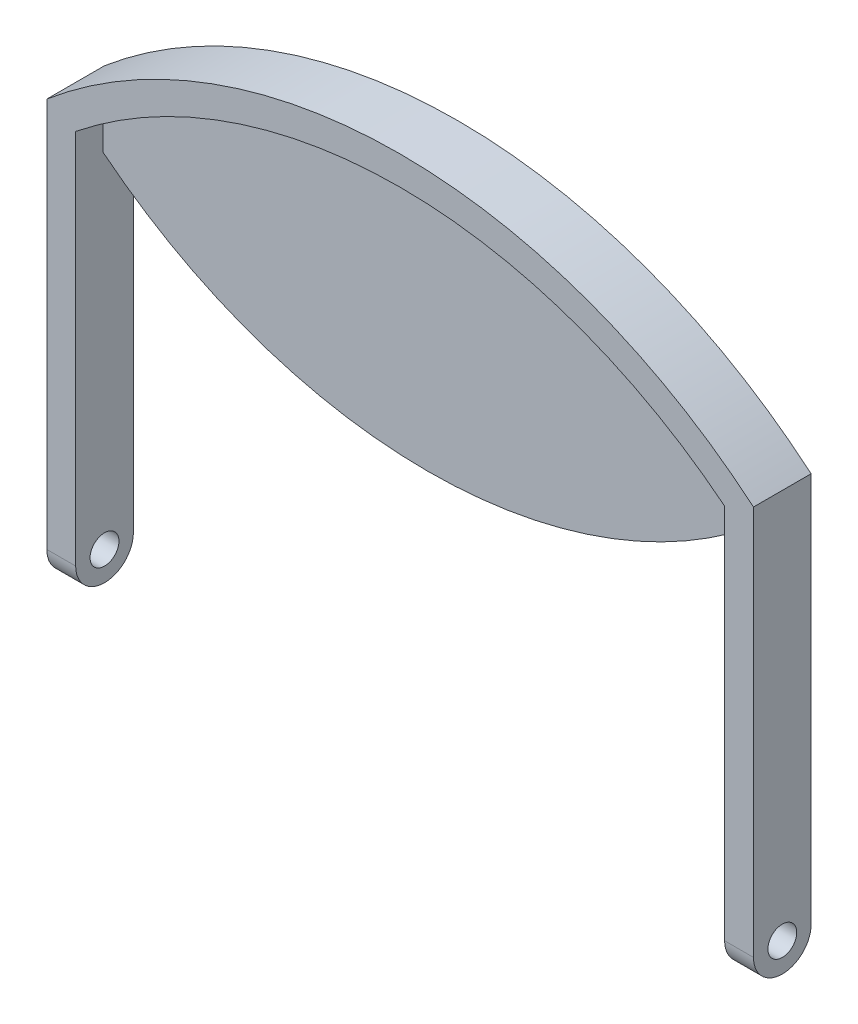
ISO-10303-21;
HEADER;
FILE_DESCRIPTION(('STEP AP214'),'2;1');
FILE_NAME('part.step','',(''),(''),'','','');
FILE_SCHEMA(('AUTOMOTIVE_DESIGN { 1 0 10303 214 1 1 1 1 }'));
ENDSEC;
DATA;
#1=APPLICATION_CONTEXT('core data for automotive mechanical design processes');
#2=APPLICATION_PROTOCOL_DEFINITION('international standard','automotive_design',2000,#1);
#3=PRODUCT_CONTEXT('',#1,'mechanical');
#4=PRODUCT('Part','Part','',(#3));
#5=PRODUCT_RELATED_PRODUCT_CATEGORY('part','',(#4));
#6=PRODUCT_DEFINITION_FORMATION('','',#4);
#7=PRODUCT_DEFINITION_CONTEXT('part definition',#1,'design');
#8=PRODUCT_DEFINITION('design','',#6,#7);
#9=PRODUCT_DEFINITION_SHAPE('','',#8);
#10=(LENGTH_UNIT() NAMED_UNIT(*) SI_UNIT(.MILLI.,.METRE.));
#11=(NAMED_UNIT(*) PLANE_ANGLE_UNIT() SI_UNIT($,.RADIAN.));
#12=(NAMED_UNIT(*) SI_UNIT($,.STERADIAN.) SOLID_ANGLE_UNIT());
#13=UNCERTAINTY_MEASURE_WITH_UNIT(LENGTH_MEASURE(1.E-05),#10,'distance_accuracy_value','');
#14=(GEOMETRIC_REPRESENTATION_CONTEXT(3) GLOBAL_UNCERTAINTY_ASSIGNED_CONTEXT((#13)) GLOBAL_UNIT_ASSIGNED_CONTEXT((#10,
#11,#12)) REPRESENTATION_CONTEXT('',''));
#15=CARTESIAN_POINT('',(0.,0.,0.));
#16=DIRECTION('',(0.,0.,1.));
#17=DIRECTION('',(1.,0.,0.));
#18=AXIS2_PLACEMENT_3D('',#15,#16,#17);
#19=CARTESIAN_POINT('',(-225.,258.975090072072,40.));
#20=DIRECTION('',(-1.,0.,0.));
#21=DIRECTION('',(0.,-1.,0.));
#22=AXIS2_PLACEMENT_3D('',#19,#20,#21);
#23=PLANE('',#22);
#24=CARTESIAN_POINT('',(-225.,20.,20.));
#25=DIRECTION('',(-1.,0.,0.));
#26=DIRECTION('',(0.,-1.,0.));
#27=AXIS2_PLACEMENT_3D('',#24,#25,#26);
#28=CIRCLE('',#27,10.0070147946264);
#29=CARTESIAN_POINT('',(-225.,9.99298520537362,20.));
#30=VERTEX_POINT('',#29);
#31=EDGE_CURVE('E158',#30,#30,#28,.T.);
#32=ORIENTED_EDGE('',*,*,#31,.T.);
#33=EDGE_LOOP('',(#32));
#34=FACE_BOUND('',#33,.T.);
#35=CARTESIAN_POINT('',(-225.,20.,20.));
#36=DIRECTION('',(-1.,0.,0.));
#37=DIRECTION('',(0.,-1.,0.));
#38=AXIS2_PLACEMENT_3D('',#35,#36,#37);
#39=CIRCLE('',#38,20.);
#40=CARTESIAN_POINT('',(-225.,20.,0.));
#41=VERTEX_POINT('',#40);
#42=CARTESIAN_POINT('',(-225.,20.,40.));
#43=VERTEX_POINT('',#42);
#44=EDGE_CURVE('E69',#41,#43,#39,.T.);
#45=ORIENTED_EDGE('',*,*,#44,.F.);
#46=DIRECTION('',(0.,1.,0.));
#47=VECTOR('',#46,1.);
#48=CARTESIAN_POINT('',(-225.,258.975090072072,0.));
#49=LINE('',#48,#47);
#50=CARTESIAN_POINT('',(-225.,281.024909927928,0.));
#51=VERTEX_POINT('',#50);
#52=EDGE_CURVE('E157',#41,#51,#49,.T.);
#53=ORIENTED_EDGE('',*,*,#52,.T.);
#54=DIRECTION('',(0.,0.,-1.));
#55=VECTOR('',#54,1.);
#56=CARTESIAN_POINT('',(-225.,281.024909927928,19.));
#57=LINE('',#56,#55);
#58=CARTESIAN_POINT('',(-225.,281.024909927928,19.));
#59=VERTEX_POINT('',#58);
#60=EDGE_CURVE('E201',#59,#51,#57,.T.);
#61=ORIENTED_EDGE('',*,*,#60,.F.);
#62=DIRECTION('',(0.,1.,0.));
#63=VECTOR('',#62,1.);
#64=CARTESIAN_POINT('',(-225.,258.975090072072,19.));
#65=LINE('',#64,#63);
#66=CARTESIAN_POINT('',(-225.,258.975090072072,19.));
#67=VERTEX_POINT('',#66);
#68=EDGE_CURVE('E240',#67,#59,#65,.T.);
#69=ORIENTED_EDGE('',*,*,#68,.F.);
#70=DIRECTION('',(0.,0.,-1.));
#71=VECTOR('',#70,1.);
#72=CARTESIAN_POINT('',(-225.,258.975090072072,40.));
#73=LINE('',#72,#71);
#74=CARTESIAN_POINT('',(-225.,258.975090072072,21.));
#75=VERTEX_POINT('',#74);
#76=EDGE_CURVE('E180',#75,#67,#73,.T.);
#77=ORIENTED_EDGE('',*,*,#76,.F.);
#78=DIRECTION('',(0.,-1.,0.));
#79=VECTOR('',#78,1.);
#80=CARTESIAN_POINT('',(-225.,258.975090072072,21.));
#81=LINE('',#80,#79);
#82=CARTESIAN_POINT('',(-225.,281.024909927928,21.));
#83=VERTEX_POINT('',#82);
#84=EDGE_CURVE('E216',#83,#75,#81,.T.);
#85=ORIENTED_EDGE('',*,*,#84,.F.);
#86=DIRECTION('',(0.,0.,1.));
#87=VECTOR('',#86,1.);
#88=CARTESIAN_POINT('',(-225.,281.024909927928,21.));
#89=LINE('',#88,#87);
#90=CARTESIAN_POINT('',(-225.,281.024909927928,40.));
#91=VERTEX_POINT('',#90);
#92=EDGE_CURVE('E214',#83,#91,#89,.T.);
#93=ORIENTED_EDGE('',*,*,#92,.T.);
#94=DIRECTION('',(0.,1.,0.));
#95=VECTOR('',#94,1.);
#96=CARTESIAN_POINT('',(-225.,258.975090072072,40.));
#97=LINE('',#96,#95);
#98=EDGE_CURVE('E164',#43,#91,#97,.T.);
#99=ORIENTED_EDGE('',*,*,#98,.F.);
#100=EDGE_LOOP('',(#45,#53,#61,#69,#77,#85,#93,#99));
#101=FACE_BOUND('',#100,.T.);
#102=ADVANCED_FACE('F54',(#34,#101),#23,.F.);
#103=CARTESIAN_POINT('',(225.,258.975090072072,40.));
#104=DIRECTION('',(1.,0.,0.));
#105=DIRECTION('',(0.,1.,0.));
#106=AXIS2_PLACEMENT_3D('',#103,#104,#105);
#107=PLANE('',#106);
#108=CARTESIAN_POINT('',(225.,20.,20.));
#109=DIRECTION('',(1.,0.,0.));
#110=DIRECTION('',(0.,1.,0.));
#111=AXIS2_PLACEMENT_3D('',#108,#109,#110);
#112=CIRCLE('',#111,10.0070147946264);
#113=CARTESIAN_POINT('',(225.,30.0070147946264,20.));
#114=VERTEX_POINT('',#113);
#115=EDGE_CURVE('E294',#114,#114,#112,.T.);
#116=ORIENTED_EDGE('',*,*,#115,.T.);
#117=EDGE_LOOP('',(#116));
#118=FACE_BOUND('',#117,.T.);
#119=DIRECTION('',(0.,-1.,0.));
#120=VECTOR('',#119,1.);
#121=CARTESIAN_POINT('',(225.,258.975090072072,0.));
#122=LINE('',#121,#120);
#123=CARTESIAN_POINT('',(225.,281.024909927928,0.));
#124=VERTEX_POINT('',#123);
#125=CARTESIAN_POINT('',(225.,20.,0.));
#126=VERTEX_POINT('',#125);
#127=EDGE_CURVE('E200',#124,#126,#122,.T.);
#128=ORIENTED_EDGE('',*,*,#127,.T.);
#129=CARTESIAN_POINT('',(225.,20.,20.));
#130=DIRECTION('',(1.,0.,0.));
#131=DIRECTION('',(0.,1.,0.));
#132=AXIS2_PLACEMENT_3D('',#129,#130,#131);
#133=CIRCLE('',#132,20.);
#134=CARTESIAN_POINT('',(225.,20.,40.));
#135=VERTEX_POINT('',#134);
#136=EDGE_CURVE('E209',#135,#126,#133,.T.);
#137=ORIENTED_EDGE('',*,*,#136,.F.);
#138=DIRECTION('',(0.,-1.,0.));
#139=VECTOR('',#138,1.);
#140=CARTESIAN_POINT('',(225.,258.975090072072,40.));
#141=LINE('',#140,#139);
#142=CARTESIAN_POINT('',(225.,281.024909927928,40.));
#143=VERTEX_POINT('',#142);
#144=EDGE_CURVE('E167',#143,#135,#141,.T.);
#145=ORIENTED_EDGE('',*,*,#144,.F.);
#146=DIRECTION('',(0.,0.,1.));
#147=VECTOR('',#146,1.);
#148=CARTESIAN_POINT('',(225.,281.024909927928,21.));
#149=LINE('',#148,#147);
#150=CARTESIAN_POINT('',(225.,281.024909927928,21.));
#151=VERTEX_POINT('',#150);
#152=EDGE_CURVE('E220',#151,#143,#149,.T.);
#153=ORIENTED_EDGE('',*,*,#152,.F.);
#154=DIRECTION('',(0.,1.,0.));
#155=VECTOR('',#154,1.);
#156=CARTESIAN_POINT('',(225.,258.975090072072,21.));
#157=LINE('',#156,#155);
#158=CARTESIAN_POINT('',(225.,258.975090072072,21.));
#159=VERTEX_POINT('',#158);
#160=EDGE_CURVE('E221',#159,#151,#157,.T.);
#161=ORIENTED_EDGE('',*,*,#160,.F.);
#162=DIRECTION('',(0.,0.,-1.));
#163=VECTOR('',#162,1.);
#164=CARTESIAN_POINT('',(225.,258.975090072072,40.));
#165=LINE('',#164,#163);
#166=CARTESIAN_POINT('',(225.,258.975090072072,19.));
#167=VERTEX_POINT('',#166);
#168=EDGE_CURVE('E178',#159,#167,#165,.T.);
#169=ORIENTED_EDGE('',*,*,#168,.T.);
#170=DIRECTION('',(0.,-1.,0.));
#171=VECTOR('',#170,1.);
#172=CARTESIAN_POINT('',(225.,258.975090072072,19.));
#173=LINE('',#172,#171);
#174=CARTESIAN_POINT('',(225.,281.024909927928,19.));
#175=VERTEX_POINT('',#174);
#176=EDGE_CURVE('E234',#175,#167,#173,.T.);
#177=ORIENTED_EDGE('',*,*,#176,.F.);
#178=DIRECTION('',(0.,0.,-1.));
#179=VECTOR('',#178,1.);
#180=CARTESIAN_POINT('',(225.,281.024909927928,19.));
#181=LINE('',#180,#179);
#182=EDGE_CURVE('E243',#175,#124,#181,.T.);
#183=ORIENTED_EDGE('',*,*,#182,.T.);
#184=EDGE_LOOP('',(#128,#137,#145,#153,#161,#169,#177,#183));
#185=FACE_BOUND('',#184,.T.);
#186=ADVANCED_FACE('F251',(#118,#185),#107,.F.);
#187=CARTESIAN_POINT('',(245.,0.,40.));
#188=DIRECTION('',(-1.,0.,0.));
#189=DIRECTION('',(0.,0.,1.));
#190=AXIS2_PLACEMENT_3D('',#187,#188,#189);
#191=PLANE('',#190);
#192=CARTESIAN_POINT('',(245.,20.,20.));
#193=DIRECTION('',(-1.,0.,0.));
#194=DIRECTION('',(0.,0.,1.));
#195=AXIS2_PLACEMENT_3D('',#192,#193,#194);
#196=CIRCLE('',#195,10.0070147946264);
#197=CARTESIAN_POINT('',(245.,20.,30.0070147946264));
#198=VERTEX_POINT('',#197);
#199=EDGE_CURVE('E299',#198,#198,#196,.T.);
#200=ORIENTED_EDGE('',*,*,#199,.T.);
#201=EDGE_LOOP('',(#200));
#202=FACE_BOUND('',#201,.T.);
#203=CARTESIAN_POINT('',(245.,20.,20.));
#204=DIRECTION('',(1.,0.,0.));
#205=DIRECTION('',(0.,0.,-1.));
#206=AXIS2_PLACEMENT_3D('',#203,#204,#205);
#207=CIRCLE('',#206,20.);
#208=CARTESIAN_POINT('',(245.,20.,40.));
#209=VERTEX_POINT('',#208);
#210=CARTESIAN_POINT('',(245.,20.,0.));
#211=VERTEX_POINT('',#210);
#212=EDGE_CURVE('E76',#209,#211,#207,.T.);
#213=ORIENTED_EDGE('',*,*,#212,.T.);
#214=DIRECTION('',(0.,1.,0.));
#215=VECTOR('',#214,1.);
#216=CARTESIAN_POINT('',(245.,0.,0.));
#217=LINE('',#216,#215);
#218=CARTESIAN_POINT('',(245.,290.473750965556,0.));
#219=VERTEX_POINT('',#218);
#220=EDGE_CURVE('E169',#211,#219,#217,.T.);
#221=ORIENTED_EDGE('',*,*,#220,.T.);
#222=DIRECTION('',(0.,0.,-1.));
#223=VECTOR('',#222,1.);
#224=CARTESIAN_POINT('',(245.,290.473750965556,40.));
#225=LINE('',#224,#223);
#226=CARTESIAN_POINT('',(245.,290.473750965556,40.));
#227=VERTEX_POINT('',#226);
#228=EDGE_CURVE('E174',#227,#219,#225,.T.);
#229=ORIENTED_EDGE('',*,*,#228,.F.);
#230=DIRECTION('',(0.,1.,0.));
#231=VECTOR('',#230,1.);
#232=CARTESIAN_POINT('',(245.,0.,40.));
#233=LINE('',#232,#231);
#234=EDGE_CURVE('E186',#209,#227,#233,.T.);
#235=ORIENTED_EDGE('',*,*,#234,.F.);
#236=EDGE_LOOP('',(#213,#221,#229,#235));
#237=FACE_BOUND('',#236,.T.);
#238=ADVANCED_FACE('F191',(#202,#237),#191,.F.);
#239=CARTESIAN_POINT('',(-245.,0.,40.));
#240=DIRECTION('',(1.,0.,0.));
#241=DIRECTION('',(0.,0.,-1.));
#242=AXIS2_PLACEMENT_3D('',#239,#240,#241);
#243=PLANE('',#242);
#244=CARTESIAN_POINT('',(-245.,20.,20.));
#245=DIRECTION('',(1.,0.,0.));
#246=DIRECTION('',(0.,0.,-1.));
#247=AXIS2_PLACEMENT_3D('',#244,#245,#246);
#248=CIRCLE('',#247,10.0070147946264);
#249=CARTESIAN_POINT('',(-245.,20.,9.99298520537362));
#250=VERTEX_POINT('',#249);
#251=EDGE_CURVE('E57',#250,#250,#248,.T.);
#252=ORIENTED_EDGE('',*,*,#251,.T.);
#253=EDGE_LOOP('',(#252));
#254=FACE_BOUND('',#253,.T.);
#255=DIRECTION('',(0.,-1.,0.));
#256=VECTOR('',#255,1.);
#257=CARTESIAN_POINT('',(-245.,0.,0.));
#258=LINE('',#257,#256);
#259=CARTESIAN_POINT('',(-245.,290.473750965556,0.));
#260=VERTEX_POINT('',#259);
#261=CARTESIAN_POINT('',(-245.,20.,0.));
#262=VERTEX_POINT('',#261);
#263=EDGE_CURVE('E155',#260,#262,#258,.T.);
#264=ORIENTED_EDGE('',*,*,#263,.T.);
#265=CARTESIAN_POINT('',(-245.,20.,20.));
#266=DIRECTION('',(1.,0.,0.));
#267=DIRECTION('',(0.,0.,-1.));
#268=AXIS2_PLACEMENT_3D('',#265,#266,#267);
#269=CIRCLE('',#268,20.);
#270=CARTESIAN_POINT('',(-245.,20.,40.));
#271=VERTEX_POINT('',#270);
#272=EDGE_CURVE('E140',#271,#262,#269,.T.);
#273=ORIENTED_EDGE('',*,*,#272,.F.);
#274=DIRECTION('',(0.,-1.,0.));
#275=VECTOR('',#274,1.);
#276=CARTESIAN_POINT('',(-245.,0.,40.));
#277=LINE('',#276,#275);
#278=CARTESIAN_POINT('',(-245.,290.473750965556,40.));
#279=VERTEX_POINT('',#278);
#280=EDGE_CURVE('E175',#279,#271,#277,.T.);
#281=ORIENTED_EDGE('',*,*,#280,.F.);
#282=DIRECTION('',(0.,0.,-1.));
#283=VECTOR('',#282,1.);
#284=CARTESIAN_POINT('',(-245.,290.473750965556,40.));
#285=LINE('',#284,#283);
#286=EDGE_CURVE('E163',#279,#260,#285,.T.);
#287=ORIENTED_EDGE('',*,*,#286,.T.);
#288=EDGE_LOOP('',(#264,#273,#281,#287));
#289=FACE_BOUND('',#288,.T.);
#290=ADVANCED_FACE('F161',(#254,#289),#243,.F.);
#291=CARTESIAN_POINT('',(0.,540.,40.));
#292=DIRECTION('',(0.,0.,-1.));
#293=DIRECTION('',(-1.,0.,0.));
#294=AXIS2_PLACEMENT_3D('',#291,#292,#293);
#295=CYLINDRICAL_SURFACE('',#294,360.);
#296=CARTESIAN_POINT('',(0.,540.,21.));
#297=DIRECTION('',(0.,0.,1.));
#298=DIRECTION('',(1.,0.,0.));
#299=AXIS2_PLACEMENT_3D('',#296,#297,#298);
#300=CIRCLE('',#299,360.);
#301=EDGE_CURVE('E227',#75,#159,#300,.T.);
#302=ORIENTED_EDGE('',*,*,#301,.F.);
#303=ORIENTED_EDGE('',*,*,#76,.T.);
#304=CARTESIAN_POINT('',(0.,540.,19.));
#305=DIRECTION('',(0.,0.,-1.));
#306=DIRECTION('',(-1.,0.,0.));
#307=AXIS2_PLACEMENT_3D('',#304,#305,#306);
#308=CIRCLE('',#307,360.);
#309=EDGE_CURVE('E237',#167,#67,#308,.T.);
#310=ORIENTED_EDGE('',*,*,#309,.F.);
#311=ORIENTED_EDGE('',*,*,#168,.F.);
#312=EDGE_LOOP('',(#302,#303,#310,#311));
#313=FACE_BOUND('',#312,.T.);
#314=ADVANCED_FACE('F271',(#313),#295,.T.);
#315=CARTESIAN_POINT('',(0.,0.,40.));
#316=DIRECTION('',(0.,0.,-1.));
#317=DIRECTION('',(-1.,0.,0.));
#318=AXIS2_PLACEMENT_3D('',#315,#316,#317);
#319=CYLINDRICAL_SURFACE('',#318,380.);
#320=CARTESIAN_POINT('',(0.,0.,0.));
#321=DIRECTION('',(0.,0.,1.));
#322=DIRECTION('',(-1.,0.,0.));
#323=AXIS2_PLACEMENT_3D('',#320,#321,#322);
#324=CIRCLE('',#323,380.);
#325=EDGE_CURVE('E165',#219,#260,#324,.T.);
#326=ORIENTED_EDGE('',*,*,#325,.T.);
#327=ORIENTED_EDGE('',*,*,#286,.F.);
#328=CARTESIAN_POINT('',(0.,0.,40.));
#329=DIRECTION('',(0.,0.,1.));
#330=DIRECTION('',(-1.,0.,0.));
#331=AXIS2_PLACEMENT_3D('',#328,#329,#330);
#332=CIRCLE('',#331,380.);
#333=EDGE_CURVE('E193',#227,#279,#332,.T.);
#334=ORIENTED_EDGE('',*,*,#333,.F.);
#335=ORIENTED_EDGE('',*,*,#228,.T.);
#336=EDGE_LOOP('',(#326,#327,#334,#335));
#337=FACE_BOUND('',#336,.T.);
#338=ADVANCED_FACE('F206',(#337),#319,.T.);
#339=CARTESIAN_POINT('',(0.,0.,40.));
#340=DIRECTION('',(0.,0.,-1.));
#341=DIRECTION('',(-1.,0.,0.));
#342=AXIS2_PLACEMENT_3D('',#339,#340,#341);
#343=PLANE('',#342);
#344=ORIENTED_EDGE('',*,*,#280,.T.);
#345=DIRECTION('',(1.,0.,0.));
#346=VECTOR('',#345,1.);
#347=CARTESIAN_POINT('',(-245.,20.,40.));
#348=LINE('',#347,#346);
#349=EDGE_CURVE('E145',#271,#43,#348,.T.);
#350=ORIENTED_EDGE('',*,*,#349,.T.);
#351=ORIENTED_EDGE('',*,*,#98,.T.);
#352=CARTESIAN_POINT('',(0.,0.,40.));
#353=DIRECTION('',(0.,0.,1.));
#354=DIRECTION('',(1.,0.,0.));
#355=AXIS2_PLACEMENT_3D('',#352,#353,#354);
#356=CIRCLE('',#355,360.);
#357=EDGE_CURVE('E257',#143,#91,#356,.T.);
#358=ORIENTED_EDGE('',*,*,#357,.F.);
#359=ORIENTED_EDGE('',*,*,#144,.T.);
#360=DIRECTION('',(1.,0.,0.));
#361=VECTOR('',#360,1.);
#362=CARTESIAN_POINT('',(-245.,20.,40.));
#363=LINE('',#362,#361);
#364=EDGE_CURVE('E62',#135,#209,#363,.T.);
#365=ORIENTED_EDGE('',*,*,#364,.T.);
#366=ORIENTED_EDGE('',*,*,#234,.T.);
#367=ORIENTED_EDGE('',*,*,#333,.T.);
#368=EDGE_LOOP('',(#344,#350,#351,#358,#359,#365,#366,#367));
#369=FACE_BOUND('',#368,.T.);
#370=ADVANCED_FACE('F185',(#369),#343,.F.);
#371=CARTESIAN_POINT('',(0.,0.,0.));
#372=DIRECTION('',(0.,0.,-1.));
#373=DIRECTION('',(-1.,0.,0.));
#374=AXIS2_PLACEMENT_3D('',#371,#372,#373);
#375=PLANE('',#374);
#376=DIRECTION('',(1.,0.,0.));
#377=VECTOR('',#376,1.);
#378=CARTESIAN_POINT('',(-245.,20.,0.));
#379=LINE('',#378,#377);
#380=EDGE_CURVE('E143',#262,#41,#379,.T.);
#381=ORIENTED_EDGE('',*,*,#380,.F.);
#382=ORIENTED_EDGE('',*,*,#263,.F.);
#383=ORIENTED_EDGE('',*,*,#325,.F.);
#384=ORIENTED_EDGE('',*,*,#220,.F.);
#385=DIRECTION('',(1.,0.,0.));
#386=VECTOR('',#385,1.);
#387=CARTESIAN_POINT('',(-245.,20.,0.));
#388=LINE('',#387,#386);
#389=EDGE_CURVE('E12',#126,#211,#388,.T.);
#390=ORIENTED_EDGE('',*,*,#389,.F.);
#391=ORIENTED_EDGE('',*,*,#127,.F.);
#392=CARTESIAN_POINT('',(0.,0.,0.));
#393=DIRECTION('',(0.,0.,-1.));
#394=DIRECTION('',(-1.,0.,0.));
#395=AXIS2_PLACEMENT_3D('',#392,#393,#394);
#396=CIRCLE('',#395,360.);
#397=EDGE_CURVE('E224',#51,#124,#396,.T.);
#398=ORIENTED_EDGE('',*,*,#397,.F.);
#399=ORIENTED_EDGE('',*,*,#52,.F.);
#400=EDGE_LOOP('',(#381,#382,#383,#384,#390,#391,#398,#399));
#401=FACE_BOUND('',#400,.T.);
#402=ADVANCED_FACE('F153',(#401),#375,.T.);
#403=CARTESIAN_POINT('',(0.,0.,19.));
#404=DIRECTION('',(0.,0.,-1.));
#405=DIRECTION('',(-1.,0.,0.));
#406=AXIS2_PLACEMENT_3D('',#403,#404,#405);
#407=CYLINDRICAL_SURFACE('',#406,360.);
#408=ORIENTED_EDGE('',*,*,#397,.T.);
#409=ORIENTED_EDGE('',*,*,#182,.F.);
#410=CARTESIAN_POINT('',(0.,0.,19.));
#411=DIRECTION('',(0.,0.,-1.));
#412=DIRECTION('',(-1.,0.,0.));
#413=AXIS2_PLACEMENT_3D('',#410,#411,#412);
#414=CIRCLE('',#413,360.);
#415=EDGE_CURVE('E231',#59,#175,#414,.T.);
#416=ORIENTED_EDGE('',*,*,#415,.F.);
#417=ORIENTED_EDGE('',*,*,#60,.T.);
#418=EDGE_LOOP('',(#408,#409,#416,#417));
#419=FACE_BOUND('',#418,.T.);
#420=ADVANCED_FACE('F254',(#419),#407,.F.);
#421=CARTESIAN_POINT('',(0.,0.,19.));
#422=DIRECTION('',(0.,0.,-1.));
#423=DIRECTION('',(-1.,0.,0.));
#424=AXIS2_PLACEMENT_3D('',#421,#422,#423);
#425=PLANE('',#424);
#426=ORIENTED_EDGE('',*,*,#415,.T.);
#427=ORIENTED_EDGE('',*,*,#176,.T.);
#428=ORIENTED_EDGE('',*,*,#309,.T.);
#429=ORIENTED_EDGE('',*,*,#68,.T.);
#430=EDGE_LOOP('',(#426,#427,#428,#429));
#431=FACE_BOUND('',#430,.T.);
#432=ADVANCED_FACE('F274',(#431),#425,.T.);
#433=CARTESIAN_POINT('',(0.,0.,21.));
#434=DIRECTION('',(0.,0.,1.));
#435=DIRECTION('',(1.,0.,0.));
#436=AXIS2_PLACEMENT_3D('',#433,#434,#435);
#437=CYLINDRICAL_SURFACE('',#436,360.);
#438=ORIENTED_EDGE('',*,*,#357,.T.);
#439=ORIENTED_EDGE('',*,*,#92,.F.);
#440=CARTESIAN_POINT('',(0.,0.,21.));
#441=DIRECTION('',(0.,0.,1.));
#442=DIRECTION('',(1.,0.,0.));
#443=AXIS2_PLACEMENT_3D('',#440,#441,#442);
#444=CIRCLE('',#443,360.);
#445=EDGE_CURVE('E261',#151,#83,#444,.T.);
#446=ORIENTED_EDGE('',*,*,#445,.F.);
#447=ORIENTED_EDGE('',*,*,#152,.T.);
#448=EDGE_LOOP('',(#438,#439,#446,#447));
#449=FACE_BOUND('',#448,.T.);
#450=ADVANCED_FACE('F264',(#449),#437,.F.);
#451=CARTESIAN_POINT('',(0.,0.,21.));
#452=DIRECTION('',(0.,0.,1.));
#453=DIRECTION('',(1.,0.,0.));
#454=AXIS2_PLACEMENT_3D('',#451,#452,#453);
#455=PLANE('',#454);
#456=ORIENTED_EDGE('',*,*,#445,.T.);
#457=ORIENTED_EDGE('',*,*,#84,.T.);
#458=ORIENTED_EDGE('',*,*,#301,.T.);
#459=ORIENTED_EDGE('',*,*,#160,.T.);
#460=EDGE_LOOP('',(#456,#457,#458,#459));
#461=FACE_BOUND('',#460,.T.);
#462=ADVANCED_FACE('F281',(#461),#455,.T.);
#463=CARTESIAN_POINT('',(-245.,20.,20.));
#464=DIRECTION('',(1.,0.,0.));
#465=DIRECTION('',(0.,0.,-1.));
#466=AXIS2_PLACEMENT_3D('',#463,#464,#465);
#467=CYLINDRICAL_SURFACE('',#466,20.);
#468=ORIENTED_EDGE('',*,*,#136,.T.);
#469=ORIENTED_EDGE('',*,*,#389,.T.);
#470=ORIENTED_EDGE('',*,*,#212,.F.);
#471=ORIENTED_EDGE('',*,*,#364,.F.);
#472=EDGE_LOOP('',(#468,#469,#470,#471));
#473=FACE_BOUND('',#472,.T.);
#474=ADVANCED_FACE('F255',(#473),#467,.T.);
#475=ORIENTED_EDGE('',*,*,#44,.T.);
#476=ORIENTED_EDGE('',*,*,#349,.F.);
#477=ORIENTED_EDGE('',*,*,#272,.T.);
#478=ORIENTED_EDGE('',*,*,#380,.T.);
#479=EDGE_LOOP('',(#475,#476,#477,#478));
#480=FACE_BOUND('',#479,.T.);
#481=ADVANCED_FACE('F142',(#480),#467,.T.);
#482=CARTESIAN_POINT('',(245.,20.,20.));
#483=DIRECTION('',(-1.,0.,0.));
#484=DIRECTION('',(0.,0.,1.));
#485=AXIS2_PLACEMENT_3D('',#482,#483,#484);
#486=CYLINDRICAL_SURFACE('',#485,10.0070147946264);
#487=ORIENTED_EDGE('',*,*,#251,.F.);
#488=EDGE_LOOP('',(#487));
#489=FACE_BOUND('',#488,.T.);
#490=ORIENTED_EDGE('',*,*,#31,.F.);
#491=EDGE_LOOP('',(#490));
#492=FACE_BOUND('',#491,.T.);
#493=ADVANCED_FACE('F307',(#489,#492),#486,.F.);
#494=ORIENTED_EDGE('',*,*,#199,.F.);
#495=EDGE_LOOP('',(#494));
#496=FACE_BOUND('',#495,.T.);
#497=ORIENTED_EDGE('',*,*,#115,.F.);
#498=EDGE_LOOP('',(#497));
#499=FACE_BOUND('',#498,.T.);
#500=ADVANCED_FACE('F309',(#496,#499),#486,.F.);
#501=CLOSED_SHELL('',(#102,#186,#238,#290,#314,#338,#370,#402,#420,#432,#450,#462,#474,#481,
#493,#500));
#502=MANIFOLD_SOLID_BREP('B2',#501);
#503=ADVANCED_BREP_SHAPE_REPRESENTATION('',(#18,#502),#14);
#504=SHAPE_DEFINITION_REPRESENTATION(#9,#503);
ENDSEC;
END-ISO-10303-21;
